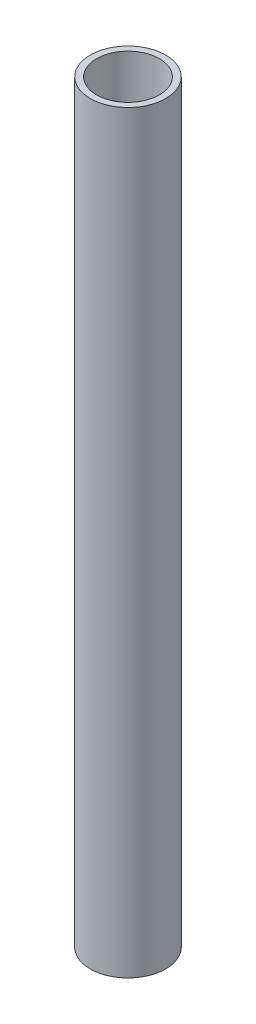
ISO-10303-21;
HEADER;
FILE_DESCRIPTION(('STEP AP214'),'2;1');
FILE_NAME('part.step','',(''),(''),'','','');
FILE_SCHEMA(('AUTOMOTIVE_DESIGN { 1 0 10303 214 1 1 1 1 }'));
ENDSEC;
DATA;
#1=APPLICATION_CONTEXT('core data for automotive mechanical design processes');
#2=APPLICATION_PROTOCOL_DEFINITION('international standard','automotive_design',2000,#1);
#3=PRODUCT_CONTEXT('',#1,'mechanical');
#4=PRODUCT('Part','Part','',(#3));
#5=PRODUCT_RELATED_PRODUCT_CATEGORY('part','',(#4));
#6=PRODUCT_DEFINITION_FORMATION('','',#4);
#7=PRODUCT_DEFINITION_CONTEXT('part definition',#1,'design');
#8=PRODUCT_DEFINITION('design','',#6,#7);
#9=PRODUCT_DEFINITION_SHAPE('','',#8);
#10=(LENGTH_UNIT() NAMED_UNIT(*) SI_UNIT(.MILLI.,.METRE.));
#11=(NAMED_UNIT(*) PLANE_ANGLE_UNIT() SI_UNIT($,.RADIAN.));
#12=(NAMED_UNIT(*) SI_UNIT($,.STERADIAN.) SOLID_ANGLE_UNIT());
#13=UNCERTAINTY_MEASURE_WITH_UNIT(LENGTH_MEASURE(1.E-05),#10,'distance_accuracy_value','');
#14=(GEOMETRIC_REPRESENTATION_CONTEXT(3) GLOBAL_UNCERTAINTY_ASSIGNED_CONTEXT((#13)) GLOBAL_UNIT_ASSIGNED_CONTEXT((#10,
#11,#12)) REPRESENTATION_CONTEXT('',''));
#15=CARTESIAN_POINT('',(0.,0.,0.));
#16=DIRECTION('',(0.,0.,1.));
#17=DIRECTION('',(1.,0.,0.));
#18=AXIS2_PLACEMENT_3D('',#15,#16,#17);
#19=CARTESIAN_POINT('',(0.,0.,0.));
#20=DIRECTION('',(0.,1.,0.));
#21=DIRECTION('',(0.,0.,1.));
#22=AXIS2_PLACEMENT_3D('',#19,#20,#21);
#23=PLANE('',#22);
#24=CARTESIAN_POINT('',(0.,0.,0.));
#25=DIRECTION('',(0.,1.,0.));
#26=DIRECTION('',(0.,0.,1.));
#27=AXIS2_PLACEMENT_3D('',#24,#25,#26);
#28=CIRCLE('',#27,6.);
#29=CARTESIAN_POINT('',(0.,0.,6.));
#30=VERTEX_POINT('',#29);
#31=EDGE_CURVE('E11',#30,#30,#28,.T.);
#32=ORIENTED_EDGE('',*,*,#31,.F.);
#33=EDGE_LOOP('',(#32));
#34=FACE_BOUND('',#33,.T.);
#35=CARTESIAN_POINT('',(0.,0.,0.));
#36=DIRECTION('',(0.,1.,0.));
#37=DIRECTION('',(0.,0.,1.));
#38=AXIS2_PLACEMENT_3D('',#35,#36,#37);
#39=CIRCLE('',#38,5.);
#40=CARTESIAN_POINT('',(0.,0.,5.));
#41=VERTEX_POINT('',#40);
#42=EDGE_CURVE('E46',#41,#41,#39,.T.);
#43=ORIENTED_EDGE('',*,*,#42,.T.);
#44=EDGE_LOOP('',(#43));
#45=FACE_BOUND('',#44,.T.);
#46=ADVANCED_FACE('F39',(#34,#45),#23,.F.);
#47=CARTESIAN_POINT('',(0.,50.,0.));
#48=DIRECTION('',(0.,-1.,0.));
#49=DIRECTION('',(0.,0.,-1.));
#50=AXIS2_PLACEMENT_3D('',#47,#48,#49);
#51=CYLINDRICAL_SURFACE('',#50,6.);
#52=ORIENTED_EDGE('',*,*,#31,.T.);
#53=EDGE_LOOP('',(#52));
#54=FACE_BOUND('',#53,.T.);
#55=CARTESIAN_POINT('',(0.,120.,0.));
#56=DIRECTION('',(0.,1.,0.));
#57=DIRECTION('',(0.,0.,1.));
#58=AXIS2_PLACEMENT_3D('',#55,#56,#57);
#59=CIRCLE('',#58,6.);
#60=CARTESIAN_POINT('',(0.,120.,6.));
#61=VERTEX_POINT('',#60);
#62=EDGE_CURVE('E50',#61,#61,#59,.T.);
#63=ORIENTED_EDGE('',*,*,#62,.F.);
#64=EDGE_LOOP('',(#63));
#65=FACE_BOUND('',#64,.T.);
#66=ADVANCED_FACE('F41',(#54,#65),#51,.T.);
#67=CARTESIAN_POINT('',(0.,50.,0.));
#68=DIRECTION('',(0.,-1.,0.));
#69=DIRECTION('',(0.,0.,-1.));
#70=AXIS2_PLACEMENT_3D('',#67,#68,#69);
#71=CYLINDRICAL_SURFACE('',#70,5.);
#72=ORIENTED_EDGE('',*,*,#42,.F.);
#73=EDGE_LOOP('',(#72));
#74=FACE_BOUND('',#73,.T.);
#75=CARTESIAN_POINT('',(0.,120.,0.));
#76=DIRECTION('',(0.,1.,0.));
#77=DIRECTION('',(0.,0.,1.));
#78=AXIS2_PLACEMENT_3D('',#75,#76,#77);
#79=CIRCLE('',#78,5.);
#80=CARTESIAN_POINT('',(0.,120.,5.));
#81=VERTEX_POINT('',#80);
#82=EDGE_CURVE('E54',#81,#81,#79,.T.);
#83=ORIENTED_EDGE('',*,*,#82,.T.);
#84=EDGE_LOOP('',(#83));
#85=FACE_BOUND('',#84,.T.);
#86=ADVANCED_FACE('F60',(#74,#85),#71,.F.);
#87=CARTESIAN_POINT('',(0.,120.,0.));
#88=DIRECTION('',(0.,1.,0.));
#89=DIRECTION('',(0.,0.,1.));
#90=AXIS2_PLACEMENT_3D('',#87,#88,#89);
#91=PLANE('',#90);
#92=ORIENTED_EDGE('',*,*,#82,.F.);
#93=EDGE_LOOP('',(#92));
#94=FACE_BOUND('',#93,.T.);
#95=ORIENTED_EDGE('',*,*,#62,.T.);
#96=EDGE_LOOP('',(#95));
#97=FACE_BOUND('',#96,.T.);
#98=ADVANCED_FACE('F62',(#94,#97),#91,.T.);
#99=CLOSED_SHELL('',(#46,#66,#86,#98));
#100=MANIFOLD_SOLID_BREP('B2',#99);
#101=ADVANCED_BREP_SHAPE_REPRESENTATION('',(#18,#100),#14);
#102=SHAPE_DEFINITION_REPRESENTATION(#9,#101);
ENDSEC;
END-ISO-10303-21;
